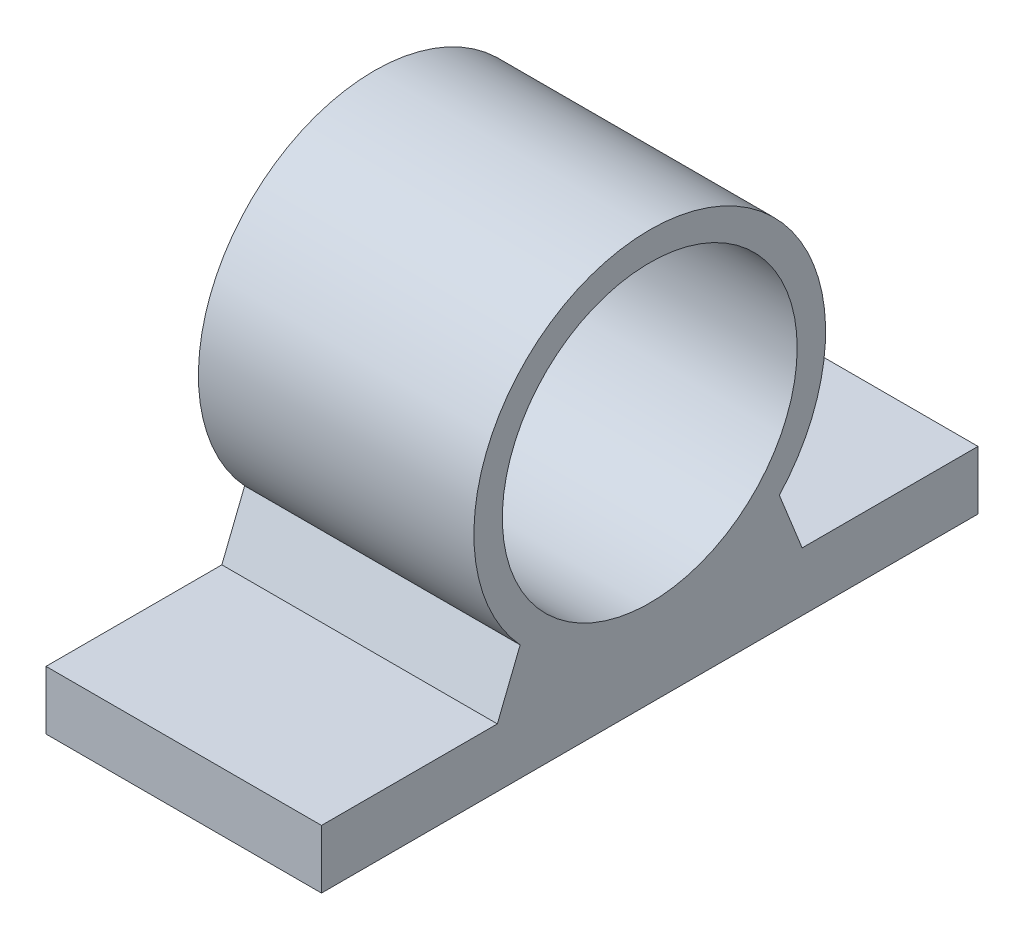
ISO-10303-21;
HEADER;
FILE_DESCRIPTION(('STEP AP214'),'2;1');
FILE_NAME('part.step','',(''),(''),'','','');
FILE_SCHEMA(('AUTOMOTIVE_DESIGN { 1 0 10303 214 1 1 1 1 }'));
ENDSEC;
DATA;
#1=APPLICATION_CONTEXT('core data for automotive mechanical design processes');
#2=APPLICATION_PROTOCOL_DEFINITION('international standard','automotive_design',2000,#1);
#3=PRODUCT_CONTEXT('',#1,'mechanical');
#4=PRODUCT('Part','Part','',(#3));
#5=PRODUCT_RELATED_PRODUCT_CATEGORY('part','',(#4));
#6=PRODUCT_DEFINITION_FORMATION('','',#4);
#7=PRODUCT_DEFINITION_CONTEXT('part definition',#1,'design');
#8=PRODUCT_DEFINITION('design','',#6,#7);
#9=PRODUCT_DEFINITION_SHAPE('','',#8);
#10=(LENGTH_UNIT() NAMED_UNIT(*) SI_UNIT(.MILLI.,.METRE.));
#11=(NAMED_UNIT(*) PLANE_ANGLE_UNIT() SI_UNIT($,.RADIAN.));
#12=(NAMED_UNIT(*) SI_UNIT($,.STERADIAN.) SOLID_ANGLE_UNIT());
#13=UNCERTAINTY_MEASURE_WITH_UNIT(LENGTH_MEASURE(1.E-05),#10,'distance_accuracy_value','');
#14=(GEOMETRIC_REPRESENTATION_CONTEXT(3) GLOBAL_UNCERTAINTY_ASSIGNED_CONTEXT((#13)) GLOBAL_UNIT_ASSIGNED_CONTEXT((#10,
#11,#12)) REPRESENTATION_CONTEXT('',''));
#15=CARTESIAN_POINT('',(0.,0.,0.));
#16=DIRECTION('',(0.,0.,1.));
#17=DIRECTION('',(1.,0.,0.));
#18=AXIS2_PLACEMENT_3D('',#15,#16,#17);
#19=CARTESIAN_POINT('',(1.25,17.5,110.));
#20=DIRECTION('',(1.,0.,0.));
#21=DIRECTION('',(0.,0.,-1.));
#22=AXIS2_PLACEMENT_3D('',#19,#20,#21);
#23=PLANE('',#22);
#24=DIRECTION('',(0.,0.,-1.));
#25=VECTOR('',#24,1.);
#26=CARTESIAN_POINT('',(1.25,-2.49999999999998,-125.));
#27=LINE('',#26,#25);
#28=CARTESIAN_POINT('',(1.25,-2.50000000000002,138.));
#29=VERTEX_POINT('',#28);
#30=CARTESIAN_POINT('',(1.25,-2.50000000000001,82.));
#31=VERTEX_POINT('',#30);
#32=EDGE_CURVE('E112',#29,#31,#27,.T.);
#33=ORIENTED_EDGE('',*,*,#32,.T.);
#34=DIRECTION('',(0.,-1.,0.));
#35=VECTOR('',#34,1.);
#36=CARTESIAN_POINT('',(1.25,2.49999999999999,82.));
#37=LINE('',#36,#35);
#38=CARTESIAN_POINT('',(1.25,2.49999999999999,82.));
#39=VERTEX_POINT('',#38);
#40=EDGE_CURVE('E146',#39,#31,#37,.T.);
#41=ORIENTED_EDGE('',*,*,#40,.F.);
#42=DIRECTION('',(0.,0.,1.));
#43=VECTOR('',#42,1.);
#44=CARTESIAN_POINT('',(1.25,2.49999999999999,82.));
#45=LINE('',#44,#43);
#46=CARTESIAN_POINT('',(1.25,2.49999999999999,97.));
#47=VERTEX_POINT('',#46);
#48=EDGE_CURVE('E153',#39,#47,#45,.T.);
#49=ORIENTED_EDGE('',*,*,#48,.T.);
#50=DIRECTION('',(0.,0.92847669088526,0.371390676354103));
#51=VECTOR('',#50,1.);
#52=CARTESIAN_POINT('',(1.25,17.5,103.));
#53=LINE('',#52,#51);
#54=CARTESIAN_POINT('',(1.25,7.36187950124047,98.9447518004962));
#55=VERTEX_POINT('',#54);
#56=EDGE_CURVE('E119',#47,#55,#53,.T.);
#57=ORIENTED_EDGE('',*,*,#56,.T.);
#58=CARTESIAN_POINT('',(1.25,17.5,110.));
#59=DIRECTION('',(1.,0.,0.));
#60=DIRECTION('',(0.,0.,-1.));
#61=AXIS2_PLACEMENT_3D('',#58,#59,#60);
#62=CIRCLE('',#61,15.);
#63=CARTESIAN_POINT('',(1.25,7.36187950124047,121.055248199504));
#64=VERTEX_POINT('',#63);
#65=EDGE_CURVE('E64',#55,#64,#62,.T.);
#66=ORIENTED_EDGE('',*,*,#65,.T.);
#67=DIRECTION('',(0.,-0.92847669088526,0.371390676354103));
#68=VECTOR('',#67,1.);
#69=CARTESIAN_POINT('',(1.25,17.5,117.));
#70=LINE('',#69,#68);
#71=CARTESIAN_POINT('',(1.25,2.49999999999998,123.));
#72=VERTEX_POINT('',#71);
#73=EDGE_CURVE('E177',#64,#72,#70,.T.);
#74=ORIENTED_EDGE('',*,*,#73,.T.);
#75=DIRECTION('',(0.,0.,-1.));
#76=VECTOR('',#75,1.);
#77=CARTESIAN_POINT('',(1.25,2.49999999999998,138.));
#78=LINE('',#77,#76);
#79=CARTESIAN_POINT('',(1.25,2.49999999999998,138.));
#80=VERTEX_POINT('',#79);
#81=EDGE_CURVE('E126',#80,#72,#78,.T.);
#82=ORIENTED_EDGE('',*,*,#81,.F.);
#83=DIRECTION('',(0.,1.,0.));
#84=VECTOR('',#83,1.);
#85=CARTESIAN_POINT('',(1.25,-2.50000000000002,138.));
#86=LINE('',#85,#84);
#87=EDGE_CURVE('E123',#29,#80,#86,.T.);
#88=ORIENTED_EDGE('',*,*,#87,.F.);
#89=EDGE_LOOP('',(#33,#41,#49,#57,#66,#74,#82,#88));
#90=FACE_BOUND('',#89,.T.);
#91=CARTESIAN_POINT('',(1.25,17.5,110.));
#92=DIRECTION('',(1.,0.,0.));
#93=DIRECTION('',(0.,0.,-1.));
#94=AXIS2_PLACEMENT_3D('',#91,#92,#93);
#95=CIRCLE('',#94,12.575);
#96=CARTESIAN_POINT('',(1.25,17.5,97.425));
#97=VERTEX_POINT('',#96);
#98=EDGE_CURVE('E169',#97,#97,#95,.T.);
#99=ORIENTED_EDGE('',*,*,#98,.F.);
#100=EDGE_LOOP('',(#99));
#101=FACE_BOUND('',#100,.T.);
#102=ADVANCED_FACE('F49',(#90,#101),#23,.T.);
#103=CARTESIAN_POINT('',(1.25,-2.49999999999998,-125.));
#104=DIRECTION('',(0.,1.,0.));
#105=DIRECTION('',(0.,0.,1.));
#106=AXIS2_PLACEMENT_3D('',#103,#104,#105);
#107=PLANE('',#106);
#108=DIRECTION('',(0.,0.,1.));
#109=VECTOR('',#108,1.);
#110=CARTESIAN_POINT('',(-22.25,-2.5,0.));
#111=LINE('',#110,#109);
#112=CARTESIAN_POINT('',(-22.25,-2.50000000000001,82.));
#113=VERTEX_POINT('',#112);
#114=CARTESIAN_POINT('',(-22.25,-2.50000000000002,138.));
#115=VERTEX_POINT('',#114);
#116=EDGE_CURVE('E158',#113,#115,#111,.T.);
#117=ORIENTED_EDGE('',*,*,#116,.F.);
#118=DIRECTION('',(-1.,0.,0.));
#119=VECTOR('',#118,1.);
#120=CARTESIAN_POINT('',(1.25,-2.50000000000001,82.));
#121=LINE('',#120,#119);
#122=EDGE_CURVE('E117',#31,#113,#121,.T.);
#123=ORIENTED_EDGE('',*,*,#122,.F.);
#124=ORIENTED_EDGE('',*,*,#32,.F.);
#125=DIRECTION('',(1.,0.,0.));
#126=VECTOR('',#125,1.);
#127=CARTESIAN_POINT('',(-22.25,-2.50000000000002,138.));
#128=LINE('',#127,#126);
#129=EDGE_CURVE('E115',#115,#29,#128,.T.);
#130=ORIENTED_EDGE('',*,*,#129,.F.);
#131=EDGE_LOOP('',(#117,#123,#124,#130));
#132=FACE_BOUND('',#131,.T.);
#133=ADVANCED_FACE('F51',(#132),#107,.F.);
#134=CARTESIAN_POINT('',(-22.25,0.,0.));
#135=DIRECTION('',(-1.,0.,0.));
#136=DIRECTION('',(0.,0.,1.));
#137=AXIS2_PLACEMENT_3D('',#134,#135,#136);
#138=PLANE('',#137);
#139=DIRECTION('',(0.,-0.92847669088526,-0.371390676354103));
#140=VECTOR('',#139,1.);
#141=CARTESIAN_POINT('',(-22.25,-33.103448275862,82.7586206896552));
#142=LINE('',#141,#140);
#143=CARTESIAN_POINT('',(-22.25,7.36187950124047,98.9447518004962));
#144=VERTEX_POINT('',#143);
#145=CARTESIAN_POINT('',(-22.25,2.49999999999999,97.));
#146=VERTEX_POINT('',#145);
#147=EDGE_CURVE('E166',#144,#146,#142,.T.);
#148=ORIENTED_EDGE('',*,*,#147,.T.);
#149=DIRECTION('',(0.,0.,1.));
#150=VECTOR('',#149,1.);
#151=CARTESIAN_POINT('',(-22.25,2.49999999999999,82.));
#152=LINE('',#151,#150);
#153=CARTESIAN_POINT('',(-22.25,2.49999999999999,82.));
#154=VERTEX_POINT('',#153);
#155=EDGE_CURVE('E151',#154,#146,#152,.T.);
#156=ORIENTED_EDGE('',*,*,#155,.F.);
#157=DIRECTION('',(0.,1.,0.));
#158=VECTOR('',#157,1.);
#159=CARTESIAN_POINT('',(-22.25,-2.50000000000001,82.));
#160=LINE('',#159,#158);
#161=EDGE_CURVE('E149',#113,#154,#160,.T.);
#162=ORIENTED_EDGE('',*,*,#161,.F.);
#163=ORIENTED_EDGE('',*,*,#116,.T.);
#164=DIRECTION('',(0.,-1.,0.));
#165=VECTOR('',#164,1.);
#166=CARTESIAN_POINT('',(-22.25,2.49999999999998,138.));
#167=LINE('',#166,#165);
#168=CARTESIAN_POINT('',(-22.25,2.49999999999998,138.));
#169=VERTEX_POINT('',#168);
#170=EDGE_CURVE('E134',#169,#115,#167,.T.);
#171=ORIENTED_EDGE('',*,*,#170,.F.);
#172=DIRECTION('',(0.,0.,-1.));
#173=VECTOR('',#172,1.);
#174=CARTESIAN_POINT('',(-22.25,2.49999999999998,138.));
#175=LINE('',#174,#173);
#176=CARTESIAN_POINT('',(-22.25,2.49999999999998,123.));
#177=VERTEX_POINT('',#176);
#178=EDGE_CURVE('E139',#169,#177,#175,.T.);
#179=ORIENTED_EDGE('',*,*,#178,.T.);
#180=DIRECTION('',(0.,0.92847669088526,-0.371390676354103));
#181=VECTOR('',#180,1.);
#182=CARTESIAN_POINT('',(-22.25,42.7586206896551,106.896551724138));
#183=LINE('',#182,#181);
#184=CARTESIAN_POINT('',(-22.25,7.36187950124048,121.055248199504));
#185=VERTEX_POINT('',#184);
#186=EDGE_CURVE('E160',#177,#185,#183,.T.);
#187=ORIENTED_EDGE('',*,*,#186,.T.);
#188=CARTESIAN_POINT('',(-22.25,17.5,110.));
#189=DIRECTION('',(-1.,0.,0.));
#190=DIRECTION('',(0.,0.,1.));
#191=AXIS2_PLACEMENT_3D('',#188,#189,#190);
#192=CIRCLE('',#191,15.);
#193=EDGE_CURVE('E163',#185,#144,#192,.T.);
#194=ORIENTED_EDGE('',*,*,#193,.T.);
#195=EDGE_LOOP('',(#148,#156,#162,#163,#171,#179,#187,#194));
#196=FACE_BOUND('',#195,.T.);
#197=CARTESIAN_POINT('',(-22.25,17.5,110.));
#198=DIRECTION('',(-1.,0.,0.));
#199=DIRECTION('',(0.,0.,1.));
#200=AXIS2_PLACEMENT_3D('',#197,#198,#199);
#201=CIRCLE('',#200,12.575);
#202=CARTESIAN_POINT('',(-22.25,17.5,122.575));
#203=VERTEX_POINT('',#202);
#204=EDGE_CURVE('E155',#203,#203,#201,.F.);
#205=ORIENTED_EDGE('',*,*,#204,.T.);
#206=EDGE_LOOP('',(#205));
#207=FACE_BOUND('',#206,.T.);
#208=ADVANCED_FACE('F186',(#196,#207),#138,.T.);
#209=CARTESIAN_POINT('',(1.25,17.5,103.));
#210=DIRECTION('',(0.,-0.371390676354103,0.92847669088526));
#211=DIRECTION('',(0.,-0.92847669088526,-0.371390676354103));
#212=AXIS2_PLACEMENT_3D('',#209,#210,#211);
#213=PLANE('',#212);
#214=DIRECTION('',(-1.,0.,0.));
#215=VECTOR('',#214,1.);
#216=CARTESIAN_POINT('',(1.25,2.49999999999999,97.));
#217=LINE('',#216,#215);
#218=EDGE_CURVE('E11',#47,#146,#217,.T.);
#219=ORIENTED_EDGE('',*,*,#218,.T.);
#220=ORIENTED_EDGE('',*,*,#147,.F.);
#221=DIRECTION('',(1.,0.,0.));
#222=VECTOR('',#221,1.);
#223=CARTESIAN_POINT('',(-1.25,7.36187950124047,98.9447518004962));
#224=LINE('',#223,#222);
#225=EDGE_CURVE('E173',#144,#55,#224,.T.);
#226=ORIENTED_EDGE('',*,*,#225,.T.);
#227=ORIENTED_EDGE('',*,*,#56,.F.);
#228=EDGE_LOOP('',(#219,#220,#226,#227));
#229=FACE_BOUND('',#228,.T.);
#230=ADVANCED_FACE('F201',(#229),#213,.F.);
#231=CARTESIAN_POINT('',(1.25,17.5,117.));
#232=DIRECTION('',(0.,-0.371390676354103,-0.92847669088526));
#233=DIRECTION('',(0.,0.92847669088526,-0.371390676354103));
#234=AXIS2_PLACEMENT_3D('',#231,#232,#233);
#235=PLANE('',#234);
#236=ORIENTED_EDGE('',*,*,#73,.F.);
#237=DIRECTION('',(1.,0.,0.));
#238=VECTOR('',#237,1.);
#239=CARTESIAN_POINT('',(-1.25,7.36187950124048,121.055248199504));
#240=LINE('',#239,#238);
#241=EDGE_CURVE('E120',#185,#64,#240,.T.);
#242=ORIENTED_EDGE('',*,*,#241,.F.);
#243=ORIENTED_EDGE('',*,*,#186,.F.);
#244=DIRECTION('',(-1.,0.,0.));
#245=VECTOR('',#244,1.);
#246=CARTESIAN_POINT('',(1.25,2.49999999999998,123.));
#247=LINE('',#246,#245);
#248=EDGE_CURVE('E57',#72,#177,#247,.T.);
#249=ORIENTED_EDGE('',*,*,#248,.F.);
#250=EDGE_LOOP('',(#236,#242,#243,#249));
#251=FACE_BOUND('',#250,.T.);
#252=ADVANCED_FACE('F203',(#251),#235,.F.);
#253=CARTESIAN_POINT('',(-1.25,17.5,110.));
#254=DIRECTION('',(1.,0.,0.));
#255=DIRECTION('',(0.,0.,-1.));
#256=AXIS2_PLACEMENT_3D('',#253,#254,#255);
#257=CYLINDRICAL_SURFACE('',#256,15.);
#258=ORIENTED_EDGE('',*,*,#65,.F.);
#259=ORIENTED_EDGE('',*,*,#225,.F.);
#260=ORIENTED_EDGE('',*,*,#193,.F.);
#261=ORIENTED_EDGE('',*,*,#241,.T.);
#262=EDGE_LOOP('',(#258,#259,#260,#261));
#263=FACE_BOUND('',#262,.T.);
#264=ADVANCED_FACE('F202',(#263),#257,.T.);
#265=CARTESIAN_POINT('',(-8.75,17.5,110.));
#266=DIRECTION('',(1.,0.,0.));
#267=DIRECTION('',(0.,0.,-1.));
#268=AXIS2_PLACEMENT_3D('',#265,#266,#267);
#269=CYLINDRICAL_SURFACE('',#268,12.575);
#270=ORIENTED_EDGE('',*,*,#98,.T.);
#271=EDGE_LOOP('',(#270));
#272=FACE_BOUND('',#271,.T.);
#273=ORIENTED_EDGE('',*,*,#204,.F.);
#274=EDGE_LOOP('',(#273));
#275=FACE_BOUND('',#274,.T.);
#276=ADVANCED_FACE('F210',(#272,#275),#269,.F.);
#277=CARTESIAN_POINT('',(-22.25,2.49999999999999,82.));
#278=DIRECTION('',(0.,-1.,0.));
#279=DIRECTION('',(0.,0.,-1.));
#280=AXIS2_PLACEMENT_3D('',#277,#278,#279);
#281=PLANE('',#280);
#282=ORIENTED_EDGE('',*,*,#218,.F.);
#283=ORIENTED_EDGE('',*,*,#48,.F.);
#284=DIRECTION('',(1.,0.,0.));
#285=VECTOR('',#284,1.);
#286=CARTESIAN_POINT('',(-22.25,2.49999999999999,82.));
#287=LINE('',#286,#285);
#288=EDGE_CURVE('E143',#154,#39,#287,.T.);
#289=ORIENTED_EDGE('',*,*,#288,.F.);
#290=ORIENTED_EDGE('',*,*,#155,.T.);
#291=EDGE_LOOP('',(#282,#283,#289,#290));
#292=FACE_BOUND('',#291,.T.);
#293=ADVANCED_FACE('F198',(#292),#281,.F.);
#294=CARTESIAN_POINT('',(0.,0.,82.));
#295=DIRECTION('',(0.,0.,-1.));
#296=DIRECTION('',(-1.,0.,0.));
#297=AXIS2_PLACEMENT_3D('',#294,#295,#296);
#298=PLANE('',#297);
#299=ORIENTED_EDGE('',*,*,#288,.T.);
#300=ORIENTED_EDGE('',*,*,#40,.T.);
#301=ORIENTED_EDGE('',*,*,#122,.T.);
#302=ORIENTED_EDGE('',*,*,#161,.T.);
#303=EDGE_LOOP('',(#299,#300,#301,#302));
#304=FACE_BOUND('',#303,.T.);
#305=ADVANCED_FACE('F192',(#304),#298,.T.);
#306=CARTESIAN_POINT('',(1.25,2.49999999999998,138.));
#307=DIRECTION('',(0.,-1.,0.));
#308=DIRECTION('',(0.,0.,-1.));
#309=AXIS2_PLACEMENT_3D('',#306,#307,#308);
#310=PLANE('',#309);
#311=ORIENTED_EDGE('',*,*,#248,.T.);
#312=ORIENTED_EDGE('',*,*,#178,.F.);
#313=DIRECTION('',(-1.,0.,0.));
#314=VECTOR('',#313,1.);
#315=CARTESIAN_POINT('',(1.25,2.49999999999998,138.));
#316=LINE('',#315,#314);
#317=EDGE_CURVE('E129',#80,#169,#316,.T.);
#318=ORIENTED_EDGE('',*,*,#317,.F.);
#319=ORIENTED_EDGE('',*,*,#81,.T.);
#320=EDGE_LOOP('',(#311,#312,#318,#319));
#321=FACE_BOUND('',#320,.T.);
#322=ADVANCED_FACE('F182',(#321),#310,.F.);
#323=CARTESIAN_POINT('',(0.,0.,138.));
#324=DIRECTION('',(0.,0.,1.));
#325=DIRECTION('',(1.,0.,0.));
#326=AXIS2_PLACEMENT_3D('',#323,#324,#325);
#327=PLANE('',#326);
#328=ORIENTED_EDGE('',*,*,#129,.T.);
#329=ORIENTED_EDGE('',*,*,#87,.T.);
#330=ORIENTED_EDGE('',*,*,#317,.T.);
#331=ORIENTED_EDGE('',*,*,#170,.T.);
#332=EDGE_LOOP('',(#328,#329,#330,#331));
#333=FACE_BOUND('',#332,.T.);
#334=ADVANCED_FACE('F132',(#333),#327,.T.);
#335=CLOSED_SHELL('',(#102,#133,#208,#230,#252,#264,#276,#293,#305,#322,#334));
#336=MANIFOLD_SOLID_BREP('B2',#335);
#337=ADVANCED_BREP_SHAPE_REPRESENTATION('',(#18,#336),#14);
#338=SHAPE_DEFINITION_REPRESENTATION(#9,#337);
ENDSEC;
END-ISO-10303-21;
